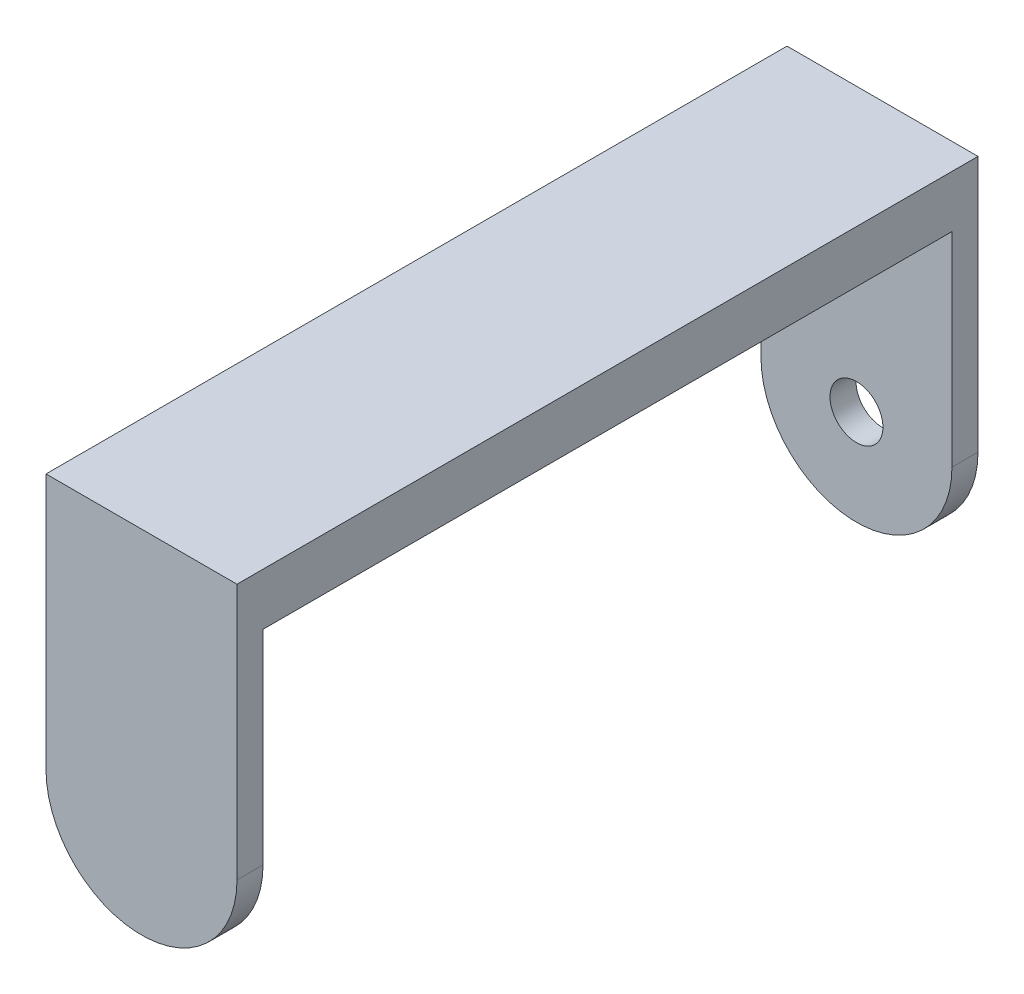
ISO-10303-21;
HEADER;
FILE_DESCRIPTION(('STEP AP214'),'2;1');
FILE_NAME('part.step','',(''),(''),'','','');
FILE_SCHEMA(('AUTOMOTIVE_DESIGN { 1 0 10303 214 1 1 1 1 }'));
ENDSEC;
DATA;
#1=APPLICATION_CONTEXT('core data for automotive mechanical design processes');
#2=APPLICATION_PROTOCOL_DEFINITION('international standard','automotive_design',2000,#1);
#3=PRODUCT_CONTEXT('',#1,'mechanical');
#4=PRODUCT('Part','Part','',(#3));
#5=PRODUCT_RELATED_PRODUCT_CATEGORY('part','',(#4));
#6=PRODUCT_DEFINITION_FORMATION('','',#4);
#7=PRODUCT_DEFINITION_CONTEXT('part definition',#1,'design');
#8=PRODUCT_DEFINITION('design','',#6,#7);
#9=PRODUCT_DEFINITION_SHAPE('','',#8);
#10=(LENGTH_UNIT() NAMED_UNIT(*) SI_UNIT(.MILLI.,.METRE.));
#11=(NAMED_UNIT(*) PLANE_ANGLE_UNIT() SI_UNIT($,.RADIAN.));
#12=(NAMED_UNIT(*) SI_UNIT($,.STERADIAN.) SOLID_ANGLE_UNIT());
#13=UNCERTAINTY_MEASURE_WITH_UNIT(LENGTH_MEASURE(1.E-05),#10,'distance_accuracy_value','');
#14=(GEOMETRIC_REPRESENTATION_CONTEXT(3) GLOBAL_UNCERTAINTY_ASSIGNED_CONTEXT((#13)) GLOBAL_UNIT_ASSIGNED_CONTEXT((#10,
#11,#12)) REPRESENTATION_CONTEXT('',''));
#15=CARTESIAN_POINT('',(0.,0.,0.));
#16=DIRECTION('',(0.,0.,1.));
#17=DIRECTION('',(1.,0.,0.));
#18=AXIS2_PLACEMENT_3D('',#15,#16,#17);
#19=CARTESIAN_POINT('',(0.,25.0718542608676,0.));
#20=DIRECTION('',(0.,1.,0.));
#21=DIRECTION('',(-1.,0.,0.));
#22=AXIS2_PLACEMENT_3D('',#19,#20,#21);
#23=PLANE('',#22);
#24=DIRECTION('',(0.,0.,1.));
#25=VECTOR('',#24,1.);
#26=CARTESIAN_POINT('',(-8.,25.0718542608676,0.));
#27=LINE('',#26,#25);
#28=CARTESIAN_POINT('',(-8.,25.0718542608676,0.));
#29=VERTEX_POINT('',#28);
#30=CARTESIAN_POINT('',(-8.,25.0718542608676,79.35));
#31=VERTEX_POINT('',#30);
#32=EDGE_CURVE('E177',#29,#31,#27,.T.);
#33=ORIENTED_EDGE('',*,*,#32,.F.);
#34=DIRECTION('',(-1.,0.,0.));
#35=VECTOR('',#34,1.);
#36=CARTESIAN_POINT('',(11.,25.0718542608676,0.));
#37=LINE('',#36,#35);
#38=CARTESIAN_POINT('',(8.,25.0718542608676,0.));
#39=VERTEX_POINT('',#38);
#40=EDGE_CURVE('E83',#39,#29,#37,.T.);
#41=ORIENTED_EDGE('',*,*,#40,.F.);
#42=DIRECTION('',(0.,0.,-1.));
#43=VECTOR('',#42,1.);
#44=CARTESIAN_POINT('',(8.,25.0718542608676,0.));
#45=LINE('',#44,#43);
#46=CARTESIAN_POINT('',(8.,25.0718542608676,79.35));
#47=VERTEX_POINT('',#46);
#48=EDGE_CURVE('E160',#47,#39,#45,.T.);
#49=ORIENTED_EDGE('',*,*,#48,.F.);
#50=DIRECTION('',(1.,0.,0.));
#51=VECTOR('',#50,1.);
#52=CARTESIAN_POINT('',(-11.,25.0718542608676,79.35));
#53=LINE('',#52,#51);
#54=EDGE_CURVE('E115',#31,#47,#53,.T.);
#55=ORIENTED_EDGE('',*,*,#54,.F.);
#56=EDGE_LOOP('',(#33,#41,#49,#55));
#57=FACE_BOUND('',#56,.T.);
#58=ADVANCED_FACE('F36',(#57),#23,.F.);
#59=CARTESIAN_POINT('',(0.,-1.42814573913243,0.));
#60=DIRECTION('',(0.,0.,1.));
#61=DIRECTION('',(1.,0.,0.));
#62=AXIS2_PLACEMENT_3D('',#59,#60,#61);
#63=PLANE('',#62);
#64=CARTESIAN_POINT('',(0.,-1.42814573913243,0.));
#65=DIRECTION('',(0.,0.,1.));
#66=DIRECTION('',(1.,0.,0.));
#67=AXIS2_PLACEMENT_3D('',#64,#65,#66);
#68=CIRCLE('',#67,3.05000000000001);
#69=CARTESIAN_POINT('',(3.05000000000001,-1.42814573913243,0.));
#70=VERTEX_POINT('',#69);
#71=EDGE_CURVE('E97',#70,#70,#68,.T.);
#72=ORIENTED_EDGE('',*,*,#71,.F.);
#73=EDGE_LOOP('',(#72));
#74=FACE_BOUND('',#73,.T.);
#75=DIRECTION('',(0.,-1.,0.));
#76=VECTOR('',#75,1.);
#77=CARTESIAN_POINT('',(-8.,-1.42814573913243,0.));
#78=LINE('',#77,#76);
#79=CARTESIAN_POINT('',(-8.,22.0718542608676,0.));
#80=VERTEX_POINT('',#79);
#81=EDGE_CURVE('E175',#29,#80,#78,.T.);
#82=ORIENTED_EDGE('',*,*,#81,.T.);
#83=DIRECTION('',(-1.,0.,0.));
#84=VECTOR('',#83,1.);
#85=CARTESIAN_POINT('',(0.,22.0718542608676,0.));
#86=LINE('',#85,#84);
#87=CARTESIAN_POINT('',(-11.,22.0718542608676,0.));
#88=VERTEX_POINT('',#87);
#89=EDGE_CURVE('E81',#80,#88,#86,.T.);
#90=ORIENTED_EDGE('',*,*,#89,.T.);
#91=DIRECTION('',(0.,-1.,0.));
#92=VECTOR('',#91,1.);
#93=CARTESIAN_POINT('',(-11.,25.0718542608676,0.));
#94=LINE('',#93,#92);
#95=CARTESIAN_POINT('',(-11.,-1.42814573913243,0.));
#96=VERTEX_POINT('',#95);
#97=EDGE_CURVE('E73',#88,#96,#94,.T.);
#98=ORIENTED_EDGE('',*,*,#97,.T.);
#99=CARTESIAN_POINT('',(0.,-1.42814573913243,0.));
#100=DIRECTION('',(0.,0.,1.));
#101=DIRECTION('',(1.,0.,0.));
#102=AXIS2_PLACEMENT_3D('',#99,#100,#101);
#103=CIRCLE('',#102,11.);
#104=CARTESIAN_POINT('',(11.,-1.42814573913243,0.));
#105=VERTEX_POINT('',#104);
#106=EDGE_CURVE('E78',#96,#105,#103,.T.);
#107=ORIENTED_EDGE('',*,*,#106,.T.);
#108=DIRECTION('',(0.,1.,0.));
#109=VECTOR('',#108,1.);
#110=CARTESIAN_POINT('',(11.,-1.42814573913243,0.));
#111=LINE('',#110,#109);
#112=CARTESIAN_POINT('',(11.,22.0718542608676,0.));
#113=VERTEX_POINT('',#112);
#114=EDGE_CURVE('E92',#105,#113,#111,.T.);
#115=ORIENTED_EDGE('',*,*,#114,.T.);
#116=DIRECTION('',(1.,0.,0.));
#117=VECTOR('',#116,1.);
#118=CARTESIAN_POINT('',(0.,22.0718542608676,0.));
#119=LINE('',#118,#117);
#120=CARTESIAN_POINT('',(8.,22.0718542608676,0.));
#121=VERTEX_POINT('',#120);
#122=EDGE_CURVE('E141',#121,#113,#119,.T.);
#123=ORIENTED_EDGE('',*,*,#122,.F.);
#124=DIRECTION('',(0.,1.,0.));
#125=VECTOR('',#124,1.);
#126=CARTESIAN_POINT('',(8.,-1.42814573913243,0.));
#127=LINE('',#126,#125);
#128=EDGE_CURVE('E157',#121,#39,#127,.T.);
#129=ORIENTED_EDGE('',*,*,#128,.T.);
#130=ORIENTED_EDGE('',*,*,#40,.T.);
#131=EDGE_LOOP('',(#82,#90,#98,#107,#115,#123,#129,#130));
#132=FACE_BOUND('',#131,.T.);
#133=ADVANCED_FACE('F75',(#74,#132),#63,.T.);
#134=CARTESIAN_POINT('',(0.,-1.42814573913239,79.35));
#135=DIRECTION('',(0.,0.,1.));
#136=DIRECTION('',(1.,0.,0.));
#137=AXIS2_PLACEMENT_3D('',#134,#135,#136);
#138=PLANE('',#137);
#139=CARTESIAN_POINT('',(0.,-1.42814573913239,79.35));
#140=DIRECTION('',(0.,0.,1.));
#141=DIRECTION('',(1.,0.,0.));
#142=AXIS2_PLACEMENT_3D('',#139,#140,#141);
#143=CIRCLE('',#142,2.74999999999998);
#144=CARTESIAN_POINT('',(2.74999999999998,-1.42814573913239,79.35));
#145=VERTEX_POINT('',#144);
#146=EDGE_CURVE('E12',#145,#145,#143,.F.);
#147=ORIENTED_EDGE('',*,*,#146,.F.);
#148=EDGE_LOOP('',(#147));
#149=FACE_BOUND('',#148,.T.);
#150=DIRECTION('',(-1.,0.,0.));
#151=VECTOR('',#150,1.);
#152=CARTESIAN_POINT('',(0.,22.0718542608676,79.35));
#153=LINE('',#152,#151);
#154=CARTESIAN_POINT('',(-8.,22.0718542608676,79.35));
#155=VERTEX_POINT('',#154);
#156=CARTESIAN_POINT('',(-11.,22.0718542608676,79.35));
#157=VERTEX_POINT('',#156);
#158=EDGE_CURVE('E173',#155,#157,#153,.T.);
#159=ORIENTED_EDGE('',*,*,#158,.F.);
#160=DIRECTION('',(0.,-1.,0.));
#161=VECTOR('',#160,1.);
#162=CARTESIAN_POINT('',(-8.,-1.42814573913239,79.35));
#163=LINE('',#162,#161);
#164=EDGE_CURVE('E180',#31,#155,#163,.T.);
#165=ORIENTED_EDGE('',*,*,#164,.F.);
#166=ORIENTED_EDGE('',*,*,#54,.T.);
#167=DIRECTION('',(0.,1.,0.));
#168=VECTOR('',#167,1.);
#169=CARTESIAN_POINT('',(8.,-1.42814573913239,79.35));
#170=LINE('',#169,#168);
#171=CARTESIAN_POINT('',(8.,22.0718542608676,79.35));
#172=VERTEX_POINT('',#171);
#173=EDGE_CURVE('E163',#172,#47,#170,.T.);
#174=ORIENTED_EDGE('',*,*,#173,.F.);
#175=DIRECTION('',(1.,0.,0.));
#176=VECTOR('',#175,1.);
#177=CARTESIAN_POINT('',(0.,22.0718542608676,79.35));
#178=LINE('',#177,#176);
#179=CARTESIAN_POINT('',(11.,22.0718542608676,79.35));
#180=VERTEX_POINT('',#179);
#181=EDGE_CURVE('E154',#172,#180,#178,.T.);
#182=ORIENTED_EDGE('',*,*,#181,.T.);
#183=DIRECTION('',(0.,1.,0.));
#184=VECTOR('',#183,1.);
#185=CARTESIAN_POINT('',(11.,-1.42814573913239,79.35));
#186=LINE('',#185,#184);
#187=CARTESIAN_POINT('',(11.,-1.42814573913239,79.35));
#188=VERTEX_POINT('',#187);
#189=EDGE_CURVE('E138',#188,#180,#186,.T.);
#190=ORIENTED_EDGE('',*,*,#189,.F.);
#191=CARTESIAN_POINT('',(0.,-1.42814573913239,79.35));
#192=DIRECTION('',(0.,0.,1.));
#193=DIRECTION('',(1.,0.,0.));
#194=AXIS2_PLACEMENT_3D('',#191,#192,#193);
#195=CIRCLE('',#194,11.);
#196=CARTESIAN_POINT('',(-11.,-1.42814573913239,79.35));
#197=VERTEX_POINT('',#196);
#198=EDGE_CURVE('E132',#197,#188,#195,.T.);
#199=ORIENTED_EDGE('',*,*,#198,.F.);
#200=DIRECTION('',(0.,-1.,0.));
#201=VECTOR('',#200,1.);
#202=CARTESIAN_POINT('',(-11.,28.0718542608676,79.35));
#203=LINE('',#202,#201);
#204=EDGE_CURVE('E136',#157,#197,#203,.T.);
#205=ORIENTED_EDGE('',*,*,#204,.F.);
#206=EDGE_LOOP('',(#159,#165,#166,#174,#182,#190,#199,#205));
#207=FACE_BOUND('',#206,.T.);
#208=ADVANCED_FACE('F208',(#149,#207),#138,.F.);
#209=CARTESIAN_POINT('',(0.,-1.42814573913243,-3.));
#210=DIRECTION('',(0.,0.,1.));
#211=DIRECTION('',(1.,0.,0.));
#212=AXIS2_PLACEMENT_3D('',#209,#210,#211);
#213=CYLINDRICAL_SURFACE('',#212,11.);
#214=ORIENTED_EDGE('',*,*,#106,.F.);
#215=DIRECTION('',(0.,0.,1.));
#216=VECTOR('',#215,1.);
#217=CARTESIAN_POINT('',(-11.,-1.42814573913243,-3.));
#218=LINE('',#217,#216);
#219=CARTESIAN_POINT('',(-11.,-1.42814573913243,-3.));
#220=VERTEX_POINT('',#219);
#221=EDGE_CURVE('E44',#220,#96,#218,.T.);
#222=ORIENTED_EDGE('',*,*,#221,.F.);
#223=CARTESIAN_POINT('',(0.,-1.42814573913243,-3.));
#224=DIRECTION('',(0.,0.,1.));
#225=DIRECTION('',(1.,0.,0.));
#226=AXIS2_PLACEMENT_3D('',#223,#224,#225);
#227=CIRCLE('',#226,11.);
#228=CARTESIAN_POINT('',(11.,-1.42814573913243,-3.));
#229=VERTEX_POINT('',#228);
#230=EDGE_CURVE('E82',#220,#229,#227,.T.);
#231=ORIENTED_EDGE('',*,*,#230,.T.);
#232=DIRECTION('',(0.,0.,1.));
#233=VECTOR('',#232,1.);
#234=CARTESIAN_POINT('',(11.,-1.42814573913243,-3.));
#235=LINE('',#234,#233);
#236=EDGE_CURVE('E89',#229,#105,#235,.T.);
#237=ORIENTED_EDGE('',*,*,#236,.T.);
#238=EDGE_LOOP('',(#214,#222,#231,#237));
#239=FACE_BOUND('',#238,.T.);
#240=ADVANCED_FACE('F38',(#239),#213,.T.);
#241=CARTESIAN_POINT('',(-11.,25.0718542608676,-3.));
#242=DIRECTION('',(-1.,0.,0.));
#243=DIRECTION('',(0.,0.,1.));
#244=AXIS2_PLACEMENT_3D('',#241,#242,#243);
#245=PLANE('',#244);
#246=DIRECTION('',(0.,-1.,0.));
#247=VECTOR('',#246,1.);
#248=CARTESIAN_POINT('',(-11.,25.0718542608676,-3.));
#249=LINE('',#248,#247);
#250=CARTESIAN_POINT('',(-11.,28.0718542608676,-3.));
#251=VERTEX_POINT('',#250);
#252=EDGE_CURVE('E59',#251,#220,#249,.T.);
#253=ORIENTED_EDGE('',*,*,#252,.T.);
#254=ORIENTED_EDGE('',*,*,#221,.T.);
#255=ORIENTED_EDGE('',*,*,#97,.F.);
#256=DIRECTION('',(0.,0.,-1.));
#257=VECTOR('',#256,1.);
#258=CARTESIAN_POINT('',(-11.,22.0718542608676,82.35));
#259=LINE('',#258,#257);
#260=EDGE_CURVE('E51',#157,#88,#259,.T.);
#261=ORIENTED_EDGE('',*,*,#260,.F.);
#262=ORIENTED_EDGE('',*,*,#204,.T.);
#263=DIRECTION('',(0.,0.,-1.));
#264=VECTOR('',#263,1.);
#265=CARTESIAN_POINT('',(-11.,-1.42814573913239,82.35));
#266=LINE('',#265,#264);
#267=CARTESIAN_POINT('',(-11.,-1.42814573913239,82.35));
#268=VERTEX_POINT('',#267);
#269=EDGE_CURVE('E119',#268,#197,#266,.T.);
#270=ORIENTED_EDGE('',*,*,#269,.F.);
#271=DIRECTION('',(0.,-1.,0.));
#272=VECTOR('',#271,1.);
#273=CARTESIAN_POINT('',(-11.,28.0718542608676,82.35));
#274=LINE('',#273,#272);
#275=CARTESIAN_POINT('',(-11.,28.0718542608676,82.35));
#276=VERTEX_POINT('',#275);
#277=EDGE_CURVE('E144',#276,#268,#274,.T.);
#278=ORIENTED_EDGE('',*,*,#277,.F.);
#279=DIRECTION('',(0.,0.,1.));
#280=VECTOR('',#279,1.);
#281=CARTESIAN_POINT('',(-11.,28.0718542608676,-3.));
#282=LINE('',#281,#280);
#283=EDGE_CURVE('E118',#251,#276,#282,.T.);
#284=ORIENTED_EDGE('',*,*,#283,.F.);
#285=EDGE_LOOP('',(#253,#254,#255,#261,#262,#270,#278,#284));
#286=FACE_BOUND('',#285,.T.);
#287=ADVANCED_FACE('F85',(#286),#245,.T.);
#288=CARTESIAN_POINT('',(11.,-1.42814573913243,-3.));
#289=DIRECTION('',(1.,0.,0.));
#290=DIRECTION('',(0.,0.,-1.));
#291=AXIS2_PLACEMENT_3D('',#288,#289,#290);
#292=PLANE('',#291);
#293=DIRECTION('',(0.,1.,0.));
#294=VECTOR('',#293,1.);
#295=CARTESIAN_POINT('',(11.,-1.42814573913243,-3.));
#296=LINE('',#295,#294);
#297=CARTESIAN_POINT('',(11.,28.0718542608676,-3.));
#298=VERTEX_POINT('',#297);
#299=EDGE_CURVE('E103',#229,#298,#296,.T.);
#300=ORIENTED_EDGE('',*,*,#299,.T.);
#301=DIRECTION('',(0.,0.,-1.));
#302=VECTOR('',#301,1.);
#303=CARTESIAN_POINT('',(11.,28.0718542608676,-3.));
#304=LINE('',#303,#302);
#305=CARTESIAN_POINT('',(11.,28.0718542608676,82.35));
#306=VERTEX_POINT('',#305);
#307=EDGE_CURVE('E122',#306,#298,#304,.T.);
#308=ORIENTED_EDGE('',*,*,#307,.F.);
#309=DIRECTION('',(0.,1.,0.));
#310=VECTOR('',#309,1.);
#311=CARTESIAN_POINT('',(11.,-1.42814573913239,82.35));
#312=LINE('',#311,#310);
#313=CARTESIAN_POINT('',(11.,-1.42814573913239,82.35));
#314=VERTEX_POINT('',#313);
#315=EDGE_CURVE('E135',#314,#306,#312,.T.);
#316=ORIENTED_EDGE('',*,*,#315,.F.);
#317=DIRECTION('',(0.,0.,-1.));
#318=VECTOR('',#317,1.);
#319=CARTESIAN_POINT('',(11.,-1.42814573913239,82.35));
#320=LINE('',#319,#318);
#321=EDGE_CURVE('E128',#314,#188,#320,.T.);
#322=ORIENTED_EDGE('',*,*,#321,.T.);
#323=ORIENTED_EDGE('',*,*,#189,.T.);
#324=DIRECTION('',(0.,0.,-1.));
#325=VECTOR('',#324,1.);
#326=CARTESIAN_POINT('',(11.,22.0718542608676,82.35));
#327=LINE('',#326,#325);
#328=EDGE_CURVE('E167',#180,#113,#327,.T.);
#329=ORIENTED_EDGE('',*,*,#328,.T.);
#330=ORIENTED_EDGE('',*,*,#114,.F.);
#331=ORIENTED_EDGE('',*,*,#236,.F.);
#332=EDGE_LOOP('',(#300,#308,#316,#322,#323,#329,#330,#331));
#333=FACE_BOUND('',#332,.T.);
#334=ADVANCED_FACE('F222',(#333),#292,.T.);
#335=CARTESIAN_POINT('',(0.,-1.42814573913243,-3.));
#336=DIRECTION('',(0.,0.,1.));
#337=DIRECTION('',(1.,0.,0.));
#338=AXIS2_PLACEMENT_3D('',#335,#336,#337);
#339=PLANE('',#338);
#340=ORIENTED_EDGE('',*,*,#230,.F.);
#341=ORIENTED_EDGE('',*,*,#252,.F.);
#342=DIRECTION('',(-1.,0.,0.));
#343=VECTOR('',#342,1.);
#344=CARTESIAN_POINT('',(-11.,28.0718542608676,-3.));
#345=LINE('',#344,#343);
#346=EDGE_CURVE('E113',#298,#251,#345,.T.);
#347=ORIENTED_EDGE('',*,*,#346,.F.);
#348=ORIENTED_EDGE('',*,*,#299,.F.);
#349=EDGE_LOOP('',(#340,#341,#347,#348));
#350=FACE_BOUND('',#349,.T.);
#351=CARTESIAN_POINT('',(0.,-1.42814573913243,-3.));
#352=DIRECTION('',(0.,0.,1.));
#353=DIRECTION('',(1.,0.,0.));
#354=AXIS2_PLACEMENT_3D('',#351,#352,#353);
#355=CIRCLE('',#354,3.05000000000001);
#356=CARTESIAN_POINT('',(3.05000000000001,-1.42814573913243,-3.));
#357=VERTEX_POINT('',#356);
#358=EDGE_CURVE('E93',#357,#357,#355,.T.);
#359=ORIENTED_EDGE('',*,*,#358,.T.);
#360=EDGE_LOOP('',(#359));
#361=FACE_BOUND('',#360,.T.);
#362=ADVANCED_FACE('F219',(#350,#361),#339,.F.);
#363=CARTESIAN_POINT('',(0.,-1.42814573913243,-3.));
#364=DIRECTION('',(0.,0.,1.));
#365=DIRECTION('',(1.,0.,0.));
#366=AXIS2_PLACEMENT_3D('',#363,#364,#365);
#367=CYLINDRICAL_SURFACE('',#366,3.05000000000001);
#368=ORIENTED_EDGE('',*,*,#358,.F.);
#369=EDGE_LOOP('',(#368));
#370=FACE_BOUND('',#369,.T.);
#371=ORIENTED_EDGE('',*,*,#71,.T.);
#372=EDGE_LOOP('',(#371));
#373=FACE_BOUND('',#372,.T.);
#374=ADVANCED_FACE('F216',(#370,#373),#367,.F.);
#375=CARTESIAN_POINT('',(0.,28.0718542608676,0.));
#376=DIRECTION('',(0.,1.,0.));
#377=DIRECTION('',(-1.,0.,0.));
#378=AXIS2_PLACEMENT_3D('',#375,#376,#377);
#379=PLANE('',#378);
#380=ORIENTED_EDGE('',*,*,#283,.T.);
#381=DIRECTION('',(-1.,0.,0.));
#382=VECTOR('',#381,1.);
#383=CARTESIAN_POINT('',(11.,28.0718542608676,82.35));
#384=LINE('',#383,#382);
#385=EDGE_CURVE('E147',#306,#276,#384,.T.);
#386=ORIENTED_EDGE('',*,*,#385,.F.);
#387=ORIENTED_EDGE('',*,*,#307,.T.);
#388=ORIENTED_EDGE('',*,*,#346,.T.);
#389=EDGE_LOOP('',(#380,#386,#387,#388));
#390=FACE_BOUND('',#389,.T.);
#391=ADVANCED_FACE('F214',(#390),#379,.T.);
#392=CARTESIAN_POINT('',(0.,-1.42814573913239,82.35));
#393=DIRECTION('',(0.,0.,-1.));
#394=DIRECTION('',(-1.,0.,0.));
#395=AXIS2_PLACEMENT_3D('',#392,#393,#394);
#396=CYLINDRICAL_SURFACE('',#395,11.);
#397=ORIENTED_EDGE('',*,*,#198,.T.);
#398=ORIENTED_EDGE('',*,*,#321,.F.);
#399=CARTESIAN_POINT('',(0.,-1.42814573913239,82.35));
#400=DIRECTION('',(0.,0.,1.));
#401=DIRECTION('',(1.,0.,0.));
#402=AXIS2_PLACEMENT_3D('',#399,#400,#401);
#403=CIRCLE('',#402,11.);
#404=EDGE_CURVE('E131',#268,#314,#403,.T.);
#405=ORIENTED_EDGE('',*,*,#404,.F.);
#406=ORIENTED_EDGE('',*,*,#269,.T.);
#407=EDGE_LOOP('',(#397,#398,#405,#406));
#408=FACE_BOUND('',#407,.T.);
#409=ADVANCED_FACE('F249',(#408),#396,.T.);
#410=CARTESIAN_POINT('',(0.,-1.42814573913239,82.35));
#411=DIRECTION('',(0.,0.,1.));
#412=DIRECTION('',(1.,0.,0.));
#413=AXIS2_PLACEMENT_3D('',#410,#411,#412);
#414=PLANE('',#413);
#415=ORIENTED_EDGE('',*,*,#277,.T.);
#416=ORIENTED_EDGE('',*,*,#404,.T.);
#417=ORIENTED_EDGE('',*,*,#315,.T.);
#418=ORIENTED_EDGE('',*,*,#385,.T.);
#419=EDGE_LOOP('',(#415,#416,#417,#418));
#420=FACE_BOUND('',#419,.T.);
#421=ADVANCED_FACE('F256',(#420),#414,.T.);
#422=CARTESIAN_POINT('',(8.,22.0718542608676,82.35));
#423=DIRECTION('',(0.,-1.,0.));
#424=DIRECTION('',(0.,0.,-1.));
#425=AXIS2_PLACEMENT_3D('',#422,#423,#424);
#426=PLANE('',#425);
#427=DIRECTION('',(0.,0.,-1.));
#428=VECTOR('',#427,1.);
#429=CARTESIAN_POINT('',(8.,22.0718542608676,82.35));
#430=LINE('',#429,#428);
#431=EDGE_CURVE('E166',#172,#121,#430,.T.);
#432=ORIENTED_EDGE('',*,*,#431,.T.);
#433=ORIENTED_EDGE('',*,*,#122,.T.);
#434=ORIENTED_EDGE('',*,*,#328,.F.);
#435=ORIENTED_EDGE('',*,*,#181,.F.);
#436=EDGE_LOOP('',(#432,#433,#434,#435));
#437=FACE_BOUND('',#436,.T.);
#438=ADVANCED_FACE('F262',(#437),#426,.T.);
#439=CARTESIAN_POINT('',(8.,0.,0.));
#440=DIRECTION('',(1.,0.,0.));
#441=DIRECTION('',(0.,0.,-1.));
#442=AXIS2_PLACEMENT_3D('',#439,#440,#441);
#443=PLANE('',#442);
#444=ORIENTED_EDGE('',*,*,#128,.F.);
#445=ORIENTED_EDGE('',*,*,#431,.F.);
#446=ORIENTED_EDGE('',*,*,#173,.T.);
#447=ORIENTED_EDGE('',*,*,#48,.T.);
#448=EDGE_LOOP('',(#444,#445,#446,#447));
#449=FACE_BOUND('',#448,.T.);
#450=ADVANCED_FACE('F270',(#449),#443,.F.);
#451=CARTESIAN_POINT('',(-8.,22.0718542608676,82.35));
#452=DIRECTION('',(0.,1.,0.));
#453=DIRECTION('',(0.,0.,1.));
#454=AXIS2_PLACEMENT_3D('',#451,#452,#453);
#455=PLANE('',#454);
#456=ORIENTED_EDGE('',*,*,#89,.F.);
#457=DIRECTION('',(0.,0.,-1.));
#458=VECTOR('',#457,1.);
#459=CARTESIAN_POINT('',(-8.,22.0718542608676,82.35));
#460=LINE('',#459,#458);
#461=EDGE_CURVE('E183',#155,#80,#460,.T.);
#462=ORIENTED_EDGE('',*,*,#461,.F.);
#463=ORIENTED_EDGE('',*,*,#158,.T.);
#464=ORIENTED_EDGE('',*,*,#260,.T.);
#465=EDGE_LOOP('',(#456,#462,#463,#464));
#466=FACE_BOUND('',#465,.T.);
#467=ADVANCED_FACE('F278',(#466),#455,.F.);
#468=CARTESIAN_POINT('',(-8.,0.,0.));
#469=DIRECTION('',(-1.,0.,0.));
#470=DIRECTION('',(0.,0.,-1.));
#471=AXIS2_PLACEMENT_3D('',#468,#469,#470);
#472=PLANE('',#471);
#473=ORIENTED_EDGE('',*,*,#81,.F.);
#474=ORIENTED_EDGE('',*,*,#32,.T.);
#475=ORIENTED_EDGE('',*,*,#164,.T.);
#476=ORIENTED_EDGE('',*,*,#461,.T.);
#477=EDGE_LOOP('',(#473,#474,#475,#476));
#478=FACE_BOUND('',#477,.T.);
#479=ADVANCED_FACE('F200',(#478),#472,.F.);
#480=CARTESIAN_POINT('',(0.,-1.42814573913239,70.721825406948));
#481=DIRECTION('',(0.,0.,1.));
#482=DIRECTION('',(1.,0.,0.));
#483=AXIS2_PLACEMENT_3D('',#480,#481,#482);
#484=CYLINDRICAL_SURFACE('',#483,2.74999999999998);
#485=CARTESIAN_POINT('',(0.,-1.42814573913239,78.75));
#486=DIRECTION('',(0.,0.,1.));
#487=DIRECTION('',(0.,-1.,0.));
#488=AXIS2_PLACEMENT_3D('',#485,#486,#487);
#489=CIRCLE('',#488,2.74999999999998);
#490=CARTESIAN_POINT('',(0.,-4.17814573913237,78.75));
#491=VERTEX_POINT('',#490);
#492=EDGE_CURVE('E185',#491,#491,#489,.T.);
#493=ORIENTED_EDGE('',*,*,#492,.T.);
#494=EDGE_LOOP('',(#493));
#495=FACE_BOUND('',#494,.T.);
#496=ORIENTED_EDGE('',*,*,#146,.T.);
#497=EDGE_LOOP('',(#496));
#498=FACE_BOUND('',#497,.T.);
#499=ADVANCED_FACE('F191',(#495,#498),#484,.T.);
#500=CARTESIAN_POINT('',(2.96909678381899,-0.10641797279183,78.75));
#501=DIRECTION('',(0.,0.,1.));
#502=DIRECTION('',(0.406685466566324,-0.913568241175081,0.));
#503=AXIS2_PLACEMENT_3D('',#500,#501,#502);
#504=PLANE('',#503);
#505=ORIENTED_EDGE('',*,*,#492,.F.);
#506=EDGE_LOOP('',(#505));
#507=FACE_BOUND('',#506,.T.);
#508=ADVANCED_FACE('F194',(#507),#504,.F.);
#509=CLOSED_SHELL('',(#58,#133,#208,#240,#287,#334,#362,#374,#391,#409,#421,#438,#450,#467,#479,
#499,#508));
#510=MANIFOLD_SOLID_BREP('B2',#509);
#511=ADVANCED_BREP_SHAPE_REPRESENTATION('',(#18,#510),#14);
#512=SHAPE_DEFINITION_REPRESENTATION(#9,#511);
ENDSEC;
END-ISO-10303-21;
